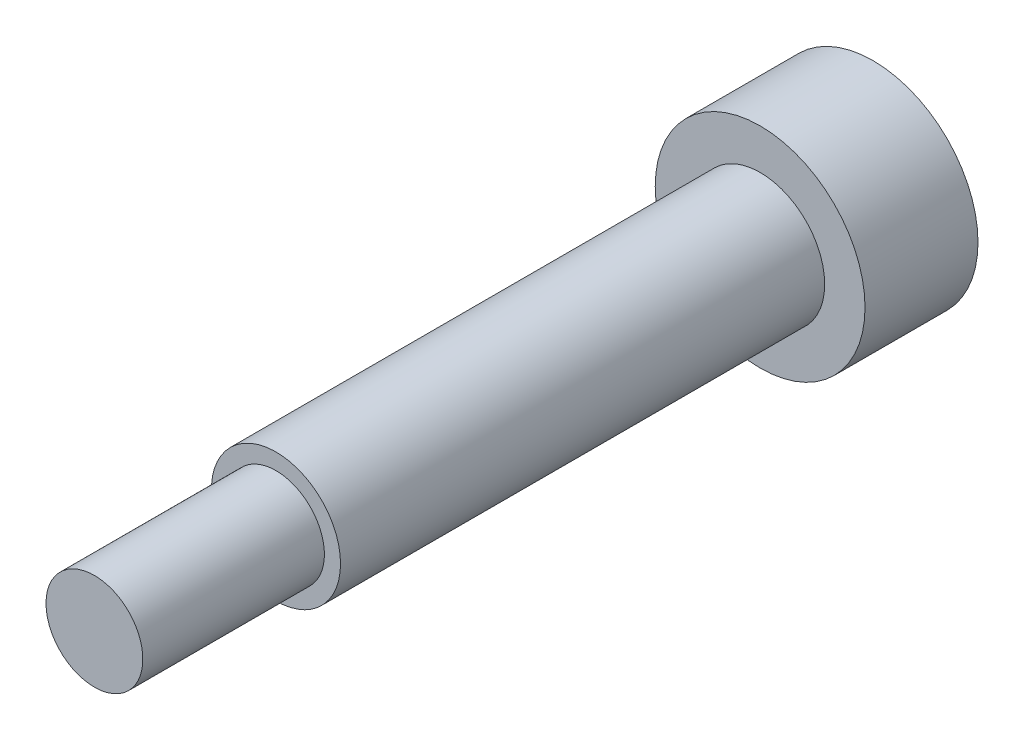
ISO-10303-21;
HEADER;
FILE_DESCRIPTION(('STEP AP214'),'2;1');
FILE_NAME('part.step','',(''),(''),'','','');
FILE_SCHEMA(('AUTOMOTIVE_DESIGN { 1 0 10303 214 1 1 1 1 }'));
ENDSEC;
DATA;
#1=APPLICATION_CONTEXT('core data for automotive mechanical design processes');
#2=APPLICATION_PROTOCOL_DEFINITION('international standard','automotive_design',2000,#1);
#3=PRODUCT_CONTEXT('',#1,'mechanical');
#4=PRODUCT('Part','Part','',(#3));
#5=PRODUCT_RELATED_PRODUCT_CATEGORY('part','',(#4));
#6=PRODUCT_DEFINITION_FORMATION('','',#4);
#7=PRODUCT_DEFINITION_CONTEXT('part definition',#1,'design');
#8=PRODUCT_DEFINITION('design','',#6,#7);
#9=PRODUCT_DEFINITION_SHAPE('','',#8);
#10=(LENGTH_UNIT() NAMED_UNIT(*) SI_UNIT(.MILLI.,.METRE.));
#11=(NAMED_UNIT(*) PLANE_ANGLE_UNIT() SI_UNIT($,.RADIAN.));
#12=(NAMED_UNIT(*) SI_UNIT($,.STERADIAN.) SOLID_ANGLE_UNIT());
#13=UNCERTAINTY_MEASURE_WITH_UNIT(LENGTH_MEASURE(1.E-05),#10,'distance_accuracy_value','');
#14=(GEOMETRIC_REPRESENTATION_CONTEXT(3) GLOBAL_UNCERTAINTY_ASSIGNED_CONTEXT((#13)) GLOBAL_UNIT_ASSIGNED_CONTEXT((#10,
#11,#12)) REPRESENTATION_CONTEXT('',''));
#15=CARTESIAN_POINT('',(0.,0.,0.));
#16=DIRECTION('',(0.,0.,1.));
#17=DIRECTION('',(1.,0.,0.));
#18=AXIS2_PLACEMENT_3D('',#15,#16,#17);
#19=CARTESIAN_POINT('',(0.,0.,7.));
#20=DIRECTION('',(0.,0.,-1.));
#21=DIRECTION('',(-1.,0.,0.));
#22=AXIS2_PLACEMENT_3D('',#19,#20,#21);
#23=CYLINDRICAL_SURFACE('',#22,6.5);
#24=CARTESIAN_POINT('',(0.,0.,7.));
#25=DIRECTION('',(0.,0.,1.));
#26=DIRECTION('',(1.,0.,0.));
#27=AXIS2_PLACEMENT_3D('',#24,#25,#26);
#28=CIRCLE('',#27,6.5);
#29=CARTESIAN_POINT('',(6.5,0.,7.));
#30=VERTEX_POINT('',#29);
#31=EDGE_CURVE('E53',#30,#30,#28,.T.);
#32=ORIENTED_EDGE('',*,*,#31,.F.);
#33=EDGE_LOOP('',(#32));
#34=FACE_BOUND('',#33,.T.);
#35=CARTESIAN_POINT('',(0.,0.,0.));
#36=DIRECTION('',(0.,0.,1.));
#37=DIRECTION('',(1.,0.,0.));
#38=AXIS2_PLACEMENT_3D('',#35,#36,#37);
#39=CIRCLE('',#38,6.5);
#40=CARTESIAN_POINT('',(6.5,0.,0.));
#41=VERTEX_POINT('',#40);
#42=EDGE_CURVE('E42',#41,#41,#39,.T.);
#43=ORIENTED_EDGE('',*,*,#42,.T.);
#44=EDGE_LOOP('',(#43));
#45=FACE_BOUND('',#44,.T.);
#46=ADVANCED_FACE('F39',(#34,#45),#23,.T.);
#47=CARTESIAN_POINT('',(0.,0.,7.));
#48=DIRECTION('',(0.,0.,1.));
#49=DIRECTION('',(1.,0.,0.));
#50=AXIS2_PLACEMENT_3D('',#47,#48,#49);
#51=PLANE('',#50);
#52=CARTESIAN_POINT('',(0.,0.,7.));
#53=DIRECTION('',(0.,0.,1.));
#54=DIRECTION('',(1.,0.,0.));
#55=AXIS2_PLACEMENT_3D('',#52,#53,#54);
#56=CIRCLE('',#55,4.);
#57=CARTESIAN_POINT('',(4.,0.,7.));
#58=VERTEX_POINT('',#57);
#59=EDGE_CURVE('E47',#58,#58,#56,.T.);
#60=ORIENTED_EDGE('',*,*,#59,.F.);
#61=EDGE_LOOP('',(#60));
#62=FACE_BOUND('',#61,.T.);
#63=ORIENTED_EDGE('',*,*,#31,.T.);
#64=EDGE_LOOP('',(#63));
#65=FACE_BOUND('',#64,.T.);
#66=ADVANCED_FACE('F73',(#62,#65),#51,.T.);
#67=CARTESIAN_POINT('',(0.,0.,0.));
#68=DIRECTION('',(0.,0.,1.));
#69=DIRECTION('',(1.,0.,0.));
#70=AXIS2_PLACEMENT_3D('',#67,#68,#69);
#71=PLANE('',#70);
#72=ORIENTED_EDGE('',*,*,#42,.F.);
#73=EDGE_LOOP('',(#72));
#74=FACE_BOUND('',#73,.T.);
#75=ADVANCED_FACE('F70',(#74),#71,.F.);
#76=CARTESIAN_POINT('',(0.,0.,37.));
#77=DIRECTION('',(0.,0.,-1.));
#78=DIRECTION('',(-1.,0.,0.));
#79=AXIS2_PLACEMENT_3D('',#76,#77,#78);
#80=CYLINDRICAL_SURFACE('',#79,4.);
#81=CARTESIAN_POINT('',(0.,0.,37.));
#82=DIRECTION('',(0.,0.,1.));
#83=DIRECTION('',(1.,0.,0.));
#84=AXIS2_PLACEMENT_3D('',#81,#82,#83);
#85=CIRCLE('',#84,4.);
#86=CARTESIAN_POINT('',(4.,0.,37.));
#87=VERTEX_POINT('',#86);
#88=EDGE_CURVE('E58',#87,#87,#85,.T.);
#89=ORIENTED_EDGE('',*,*,#88,.F.);
#90=EDGE_LOOP('',(#89));
#91=FACE_BOUND('',#90,.T.);
#92=ORIENTED_EDGE('',*,*,#59,.T.);
#93=EDGE_LOOP('',(#92));
#94=FACE_BOUND('',#93,.T.);
#95=ADVANCED_FACE('F72',(#91,#94),#80,.T.);
#96=CARTESIAN_POINT('',(0.,0.,37.));
#97=DIRECTION('',(0.,0.,1.));
#98=DIRECTION('',(1.,0.,0.));
#99=AXIS2_PLACEMENT_3D('',#96,#97,#98);
#100=PLANE('',#99);
#101=CARTESIAN_POINT('',(0.,0.,37.));
#102=DIRECTION('',(0.,0.,1.));
#103=DIRECTION('',(1.,0.,0.));
#104=AXIS2_PLACEMENT_3D('',#101,#102,#103);
#105=CIRCLE('',#104,3.);
#106=CARTESIAN_POINT('',(-3.,0.,37.));
#107=VERTEX_POINT('',#106);
#108=EDGE_CURVE('E10',#107,#107,#105,.T.);
#109=ORIENTED_EDGE('',*,*,#108,.F.);
#110=EDGE_LOOP('',(#109));
#111=FACE_BOUND('',#110,.T.);
#112=ORIENTED_EDGE('',*,*,#88,.T.);
#113=EDGE_LOOP('',(#112));
#114=FACE_BOUND('',#113,.T.);
#115=ADVANCED_FACE('F78',(#111,#114),#100,.T.);
#116=CARTESIAN_POINT('',(0.,0.,48.25));
#117=DIRECTION('',(0.,0.,-1.));
#118=DIRECTION('',(-1.,0.,0.));
#119=AXIS2_PLACEMENT_3D('',#116,#117,#118);
#120=CYLINDRICAL_SURFACE('',#119,3.);
#121=CARTESIAN_POINT('',(0.,0.,48.25));
#122=DIRECTION('',(0.,0.,1.));
#123=DIRECTION('',(1.,0.,0.));
#124=AXIS2_PLACEMENT_3D('',#121,#122,#123);
#125=CIRCLE('',#124,3.);
#126=CARTESIAN_POINT('',(-3.,0.,48.25));
#127=VERTEX_POINT('',#126);
#128=EDGE_CURVE('E57',#127,#127,#125,.T.);
#129=CARTESIAN_POINT('',(-3.,0.,48.25));
#130=CARTESIAN_POINT('',(-3.,0.,48.1328125));
#131=CARTESIAN_POINT('',(-3.,0.,48.015625));
#132=CARTESIAN_POINT('',(-3.,0.,47.78125));
#133=CARTESIAN_POINT('',(-3.,0.,47.6640625));
#134=CARTESIAN_POINT('',(-3.,0.,47.4296875));
#135=CARTESIAN_POINT('',(-3.,0.,47.3125));
#136=CARTESIAN_POINT('',(-3.,0.,47.078125));
#137=CARTESIAN_POINT('',(-3.,0.,46.9609375));
#138=CARTESIAN_POINT('',(-3.,0.,46.7265625));
#139=CARTESIAN_POINT('',(-3.,0.,46.609375));
#140=CARTESIAN_POINT('',(-3.,0.,46.375));
#141=CARTESIAN_POINT('',(-3.,0.,46.2578125));
#142=CARTESIAN_POINT('',(-3.,0.,46.0234375));
#143=CARTESIAN_POINT('',(-3.,0.,45.90625));
#144=CARTESIAN_POINT('',(-3.,0.,45.671875));
#145=CARTESIAN_POINT('',(-3.,0.,45.5546875));
#146=CARTESIAN_POINT('',(-3.,0.,45.3203125));
#147=CARTESIAN_POINT('',(-3.,0.,45.203125));
#148=CARTESIAN_POINT('',(-3.,0.,44.96875));
#149=CARTESIAN_POINT('',(-3.,0.,44.8515625));
#150=CARTESIAN_POINT('',(-3.,0.,44.6171875));
#151=CARTESIAN_POINT('',(-3.,0.,44.5));
#152=CARTESIAN_POINT('',(-3.,0.,44.265625));
#153=CARTESIAN_POINT('',(-3.,0.,44.1484375));
#154=CARTESIAN_POINT('',(-3.,0.,43.9140625));
#155=CARTESIAN_POINT('',(-3.,0.,43.796875));
#156=CARTESIAN_POINT('',(-3.,0.,43.5625));
#157=CARTESIAN_POINT('',(-3.,0.,43.4453125));
#158=CARTESIAN_POINT('',(-3.,0.,43.2109375));
#159=CARTESIAN_POINT('',(-3.,0.,43.09375));
#160=CARTESIAN_POINT('',(-3.,0.,42.859375));
#161=CARTESIAN_POINT('',(-3.,0.,42.7421875));
#162=CARTESIAN_POINT('',(-3.,0.,42.5078125));
#163=CARTESIAN_POINT('',(-3.,0.,42.390625));
#164=CARTESIAN_POINT('',(-3.,0.,42.15625));
#165=CARTESIAN_POINT('',(-3.,0.,42.0390625));
#166=CARTESIAN_POINT('',(-3.,0.,41.8046875));
#167=CARTESIAN_POINT('',(-3.,0.,41.6875));
#168=CARTESIAN_POINT('',(-3.,0.,41.453125));
#169=CARTESIAN_POINT('',(-3.,0.,41.3359375));
#170=CARTESIAN_POINT('',(-3.,0.,41.1015625));
#171=CARTESIAN_POINT('',(-3.,0.,40.984375));
#172=CARTESIAN_POINT('',(-3.,0.,40.75));
#173=CARTESIAN_POINT('',(-3.,0.,40.6328125));
#174=CARTESIAN_POINT('',(-3.,0.,40.3984375));
#175=CARTESIAN_POINT('',(-3.,0.,40.28125));
#176=CARTESIAN_POINT('',(-3.,0.,40.046875));
#177=CARTESIAN_POINT('',(-3.,0.,39.9296875));
#178=CARTESIAN_POINT('',(-3.,0.,39.6953125));
#179=CARTESIAN_POINT('',(-3.,0.,39.578125));
#180=CARTESIAN_POINT('',(-3.,0.,39.34375));
#181=CARTESIAN_POINT('',(-3.,0.,39.2265625));
#182=CARTESIAN_POINT('',(-3.,0.,38.9921875));
#183=CARTESIAN_POINT('',(-3.,0.,38.875));
#184=CARTESIAN_POINT('',(-3.,0.,38.640625));
#185=CARTESIAN_POINT('',(-3.,0.,38.5234375));
#186=CARTESIAN_POINT('',(-3.,0.,38.2890625));
#187=CARTESIAN_POINT('',(-3.,0.,38.171875));
#188=CARTESIAN_POINT('',(-3.,0.,37.9375));
#189=CARTESIAN_POINT('',(-3.,0.,37.8203125));
#190=CARTESIAN_POINT('',(-3.,0.,37.5859375));
#191=CARTESIAN_POINT('',(-3.,0.,37.46875));
#192=CARTESIAN_POINT('',(-3.,0.,37.234375));
#193=CARTESIAN_POINT('',(-3.,0.,37.1171875));
#194=CARTESIAN_POINT('',(-3.,0.,37.));
#195=B_SPLINE_CURVE_WITH_KNOTS('',3,(#129,#130,#131,#132,#133,#134,#135,#136,#137,#138,#139,
#140,#141,#142,#143,#144,#145,#146,#147,#148,#149,#150,#151,#152,#153,#154,#155,#156,#157,#158,
#159,#160,#161,#162,#163,#164,#165,#166,#167,#168,#169,#170,#171,#172,#173,#174,#175,#176,#177,
#178,#179,#180,#181,#182,#183,#184,#185,#186,#187,#188,#189,#190,#191,#192,#193,#194),
.UNSPECIFIED.,.F.,.F.,(4,2,2,2,2,2,2,2,2,2,2,2,2,2,2,2,2,2,2,2,2,2,2,2,2,2,2,2,2,2,2,2,4),(0.,
0.351562499999999,0.703124999999999,1.0546875,1.40625,1.7578125,2.109375,2.4609375,2.8125,
3.1640625,3.51562499999999,3.86718749999999,4.21875,4.5703125,4.921875,5.2734375,5.625,
5.9765625,6.328125,6.6796875,7.03125,7.3828125,7.73437499999999,8.08593749999999,
8.43749999999999,8.78906249999999,9.140625,9.4921875,9.84375,10.1953125,10.546875,10.8984375,
11.25),.UNSPECIFIED.);
#196=EDGE_CURVE('BSEAM108',#127,#107,#195,.T.);
#197=ORIENTED_EDGE('',*,*,#128,.F.);
#198=ORIENTED_EDGE('',*,*,#108,.T.);
#199=ORIENTED_EDGE('',*,*,#196,.T.);
#200=ORIENTED_EDGE('',*,*,#196,.F.);
#201=EDGE_LOOP('',(#197,#199,#198,#200));
#202=FACE_BOUND('',#201,.T.);
#203=ADVANCED_FACE('F108',(#202),#120,.T.);
#204=CARTESIAN_POINT('',(0.,0.,48.25));
#205=DIRECTION('',(0.,0.,1.));
#206=DIRECTION('',(1.,0.,0.));
#207=AXIS2_PLACEMENT_3D('',#204,#205,#206);
#208=PLANE('',#207);
#209=ORIENTED_EDGE('',*,*,#128,.T.);
#210=EDGE_LOOP('',(#209));
#211=FACE_BOUND('',#210,.T.);
#212=ADVANCED_FACE('F119',(#211),#208,.T.);
#213=CLOSED_SHELL('',(#46,#66,#75,#95,#115,#203,#212));
#214=MANIFOLD_SOLID_BREP('B2',#213);
#215=ADVANCED_BREP_SHAPE_REPRESENTATION('',(#18,#214),#14);
#216=SHAPE_DEFINITION_REPRESENTATION(#9,#215);
ENDSEC;
END-ISO-10303-21;
